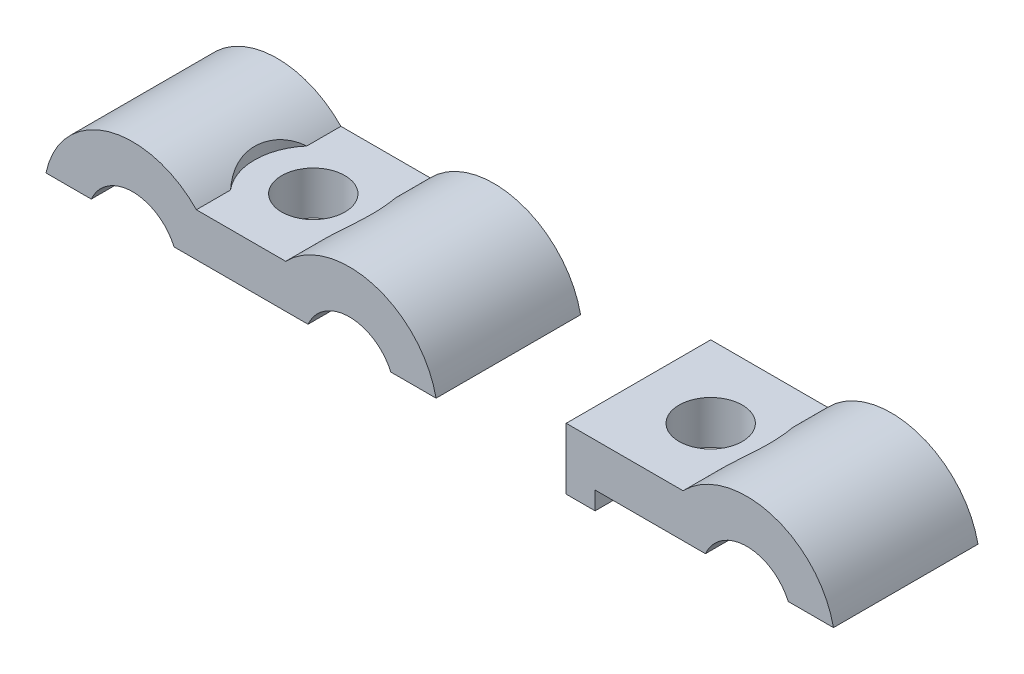
ISO-10303-21;
HEADER;
FILE_DESCRIPTION(('STEP AP214'),'2;1');
FILE_NAME('part.step','',(''),(''),'','','');
FILE_SCHEMA(('AUTOMOTIVE_DESIGN { 1 0 10303 214 1 1 1 1 }'));
ENDSEC;
DATA;
#1=APPLICATION_CONTEXT('core data for automotive mechanical design processes');
#2=APPLICATION_PROTOCOL_DEFINITION('international standard','automotive_design',2000,#1);
#3=PRODUCT_CONTEXT('',#1,'mechanical');
#4=PRODUCT('Part','Part','',(#3));
#5=PRODUCT_RELATED_PRODUCT_CATEGORY('part','',(#4));
#6=PRODUCT_DEFINITION_FORMATION('','',#4);
#7=PRODUCT_DEFINITION_CONTEXT('part definition',#1,'design');
#8=PRODUCT_DEFINITION('design','',#6,#7);
#9=PRODUCT_DEFINITION_SHAPE('','',#8);
#10=(LENGTH_UNIT() NAMED_UNIT(*) SI_UNIT(.MILLI.,.METRE.));
#11=(NAMED_UNIT(*) PLANE_ANGLE_UNIT() SI_UNIT($,.RADIAN.));
#12=(NAMED_UNIT(*) SI_UNIT($,.STERADIAN.) SOLID_ANGLE_UNIT());
#13=UNCERTAINTY_MEASURE_WITH_UNIT(LENGTH_MEASURE(1.E-05),#10,'distance_accuracy_value','');
#14=(GEOMETRIC_REPRESENTATION_CONTEXT(3) GLOBAL_UNCERTAINTY_ASSIGNED_CONTEXT((#13)) GLOBAL_UNIT_ASSIGNED_CONTEXT((#10,
#11,#12)) REPRESENTATION_CONTEXT('',''));
#15=CARTESIAN_POINT('',(0.,0.,0.));
#16=DIRECTION('',(0.,0.,1.));
#17=DIRECTION('',(1.,0.,0.));
#18=AXIS2_PLACEMENT_3D('',#15,#16,#17);
#19=CARTESIAN_POINT('',(40.,0.,8.));
#20=DIRECTION('',(0.,0.,-1.));
#21=DIRECTION('',(-1.,0.,0.));
#22=AXIS2_PLACEMENT_3D('',#19,#20,#21);
#23=CYLINDRICAL_SURFACE('',#22,4.9);
#24=CARTESIAN_POINT('',(36.4715442471245,3.4,6.11044285269837));
#25=CARTESIAN_POINT('',(36.5126094897117,3.44262606664709,6.06237296474449));
#26=CARTESIAN_POINT('',(36.5531708476087,3.48316500531181,6.01200938624019));
#27=CARTESIAN_POINT('',(36.6325990258749,3.56000670766943,5.90689234932348));
#28=CARTESIAN_POINT('',(36.6714656227098,3.59630891360113,5.85213831450949));
#29=CARTESIAN_POINT('',(36.7467730446983,3.66457379801481,5.73850086774534));
#30=CARTESIAN_POINT('',(36.7832159839324,3.69654028439891,5.6796211490794));
#31=CARTESIAN_POINT('',(36.8530655222025,3.75618317346056,5.55802163308008));
#32=CARTESIAN_POINT('',(36.8864724109546,3.78385998565997,5.49530220311047));
#33=CARTESIAN_POINT('',(36.9497210577356,3.83503029139799,5.36631374041905));
#34=CARTESIAN_POINT('',(36.9795571721354,3.85851719076012,5.30003932228713));
#35=CARTESIAN_POINT('',(37.0351089544764,3.90136543889939,5.16446699483715));
#36=CARTESIAN_POINT('',(37.0608230414361,3.92072520567156,5.09516793833865));
#37=CARTESIAN_POINT('',(37.1076783683864,3.95541751702336,4.95412227211976));
#38=CARTESIAN_POINT('',(37.1288233185441,3.97075333126209,4.88237770339834));
#39=CARTESIAN_POINT('',(37.1662458741903,3.9975441330316,4.73691345899355));
#40=CARTESIAN_POINT('',(37.1825216557406,4.00899766651487,4.66319305442191));
#41=CARTESIAN_POINT('',(37.2231850010033,4.0373808114907,4.44233892201103));
#42=CARTESIAN_POINT('',(37.2402314984068,4.04892008521854,4.29304863676129));
#43=CARTESIAN_POINT('',(37.2534647149747,4.05790534981671,3.99314976333009));
#44=CARTESIAN_POINT('',(37.2496434189639,4.05534592547131,3.8425406907895));
#45=CARTESIAN_POINT('',(37.2212688634578,4.03595737142103,3.54321595238569));
#46=CARTESIAN_POINT('',(37.1965828989471,4.01903689862099,3.39451860597906));
#47=CARTESIAN_POINT('',(37.1276969981287,3.97009329973268,3.10432058037719));
#48=CARTESIAN_POINT('',(37.0835004386544,3.93807278704717,2.96281866054393));
#49=CARTESIAN_POINT('',(36.9785180990321,3.85810424623574,2.69156170372002));
#50=CARTESIAN_POINT('',(36.9177929572136,3.81021430123257,2.56176599339154));
#51=CARTESIAN_POINT('',(36.7837083328936,3.69770912332429,2.31687482952486));
#52=CARTESIAN_POINT('',(36.710362188543,3.63311151155202,2.20176407800157));
#53=CARTESIAN_POINT('',(36.6070653237872,3.53543616834515,2.05893307027632));
#54=CARTESIAN_POINT('',(36.5803749522193,3.5096454804251,2.02361904360092));
#55=CARTESIAN_POINT('',(36.5263815938003,3.45621374118089,1.9550580869612));
#56=CARTESIAN_POINT('',(36.4990798495167,3.42857625017818,1.92180740512314));
#57=CARTESIAN_POINT('',(36.4715442471245,3.4,1.88955714730163));
#58=B_SPLINE_CURVE_WITH_KNOTS('',3,(#24,#25,#26,#27,#28,#29,#30,#31,#32,#33,#34,#35,#36,#37,#38,
#39,#40,#41,#42,#43,#44,#45,#46,#47,#48,#49,#50,#51,#52,#53,#54,#55,#56,#57),.UNSPECIFIED.,.F.,
.F.,(4,2,2,2,2,2,2,2,2,2,2,2,2,2,2,2,4),(0.,0.228698429314769,0.457426932644239,
0.685953233105201,0.914457703413783,1.14331868592199,1.37226723789039,1.60102917775049,
1.8298767023889,2.27968502233134,2.72966612268757,3.18253095224295,3.63531743206605,
4.08646465931051,4.53713800012588,4.69077450330599,4.8441229207092),.UNSPECIFIED.);
#59=CARTESIAN_POINT('',(36.4715442471245,3.4,6.11044285269837));
#60=VERTEX_POINT('',#59);
#61=CARTESIAN_POINT('',(36.4715442471245,3.4,1.88955714730163));
#62=VERTEX_POINT('',#61);
#63=EDGE_CURVE('E211',#60,#62,#58,.T.);
#64=ORIENTED_EDGE('',*,*,#63,.F.);
#65=DIRECTION('',(0.,0.,-1.));
#66=VECTOR('',#65,1.);
#67=CARTESIAN_POINT('',(36.4715442471245,3.4,8.));
#68=LINE('',#67,#66);
#69=CARTESIAN_POINT('',(36.4715442471245,3.4,8.));
#70=VERTEX_POINT('',#69);
#71=EDGE_CURVE('E184',#70,#60,#68,.T.);
#72=ORIENTED_EDGE('',*,*,#71,.F.);
#73=CARTESIAN_POINT('',(40.,0.,8.));
#74=DIRECTION('',(0.,0.,1.));
#75=DIRECTION('',(1.,0.,0.));
#76=AXIS2_PLACEMENT_3D('',#73,#74,#75);
#77=CIRCLE('',#76,4.9);
#78=CARTESIAN_POINT('',(44.7968739820846,1.,8.));
#79=VERTEX_POINT('',#78);
#80=EDGE_CURVE('E153',#79,#70,#77,.T.);
#81=ORIENTED_EDGE('',*,*,#80,.F.);
#82=DIRECTION('',(0.,0.,-1.));
#83=VECTOR('',#82,1.);
#84=CARTESIAN_POINT('',(44.7968739820846,1.,8.));
#85=LINE('',#84,#83);
#86=CARTESIAN_POINT('',(44.7968739820846,1.,0.));
#87=VERTEX_POINT('',#86);
#88=EDGE_CURVE('E186',#79,#87,#85,.T.);
#89=ORIENTED_EDGE('',*,*,#88,.T.);
#90=CARTESIAN_POINT('',(40.,0.,0.));
#91=DIRECTION('',(0.,0.,1.));
#92=DIRECTION('',(1.,0.,0.));
#93=AXIS2_PLACEMENT_3D('',#90,#91,#92);
#94=CIRCLE('',#93,4.9);
#95=CARTESIAN_POINT('',(36.4715442471245,3.4,0.));
#96=VERTEX_POINT('',#95);
#97=EDGE_CURVE('E173',#87,#96,#94,.T.);
#98=ORIENTED_EDGE('',*,*,#97,.T.);
#99=EDGE_CURVE('E143',#62,#96,#68,.T.);
#100=ORIENTED_EDGE('',*,*,#99,.F.);
#101=EDGE_LOOP('',(#64,#72,#81,#89,#98,#100));
#102=FACE_BOUND('',#101,.T.);
#103=ADVANCED_FACE('F57',(#102),#23,.T.);
#104=CARTESIAN_POINT('',(31.6,0.,8.));
#105=DIRECTION('',(1.,0.,0.));
#106=DIRECTION('',(0.,0.,-1.));
#107=AXIS2_PLACEMENT_3D('',#104,#105,#106);
#108=PLANE('',#107);
#109=DIRECTION('',(0.,-1.,0.));
#110=VECTOR('',#109,1.);
#111=CARTESIAN_POINT('',(31.6,0.,0.));
#112=LINE('',#111,#110);
#113=CARTESIAN_POINT('',(31.6,1.,0.));
#114=VERTEX_POINT('',#113);
#115=CARTESIAN_POINT('',(31.6,0.,0.));
#116=VERTEX_POINT('',#115);
#117=EDGE_CURVE('E161',#114,#116,#112,.T.);
#118=ORIENTED_EDGE('',*,*,#117,.F.);
#119=DIRECTION('',(0.,0.,-1.));
#120=VECTOR('',#119,1.);
#121=CARTESIAN_POINT('',(31.6,1.,8.));
#122=LINE('',#121,#120);
#123=CARTESIAN_POINT('',(31.6,1.,8.));
#124=VERTEX_POINT('',#123);
#125=EDGE_CURVE('E12',#124,#114,#122,.T.);
#126=ORIENTED_EDGE('',*,*,#125,.F.);
#127=DIRECTION('',(0.,-1.,0.));
#128=VECTOR('',#127,1.);
#129=CARTESIAN_POINT('',(31.6,0.,8.));
#130=LINE('',#129,#128);
#131=CARTESIAN_POINT('',(31.6,0.,8.));
#132=VERTEX_POINT('',#131);
#133=EDGE_CURVE('E181',#124,#132,#130,.T.);
#134=ORIENTED_EDGE('',*,*,#133,.T.);
#135=DIRECTION('',(0.,0.,-1.));
#136=VECTOR('',#135,1.);
#137=CARTESIAN_POINT('',(31.6,0.,8.));
#138=LINE('',#137,#136);
#139=EDGE_CURVE('E112',#132,#116,#138,.T.);
#140=ORIENTED_EDGE('',*,*,#139,.T.);
#141=EDGE_LOOP('',(#118,#126,#134,#140));
#142=FACE_BOUND('',#141,.T.);
#143=ADVANCED_FACE('F59',(#142),#108,.T.);
#144=CARTESIAN_POINT('',(0.,1.,8.));
#145=DIRECTION('',(0.,1.,0.));
#146=DIRECTION('',(0.,0.,1.));
#147=AXIS2_PLACEMENT_3D('',#144,#145,#146);
#148=PLANE('',#147);
#149=CARTESIAN_POINT('',(34.,1.,4.));
#150=DIRECTION('',(0.,1.,0.));
#151=DIRECTION('',(0.,0.,1.));
#152=AXIS2_PLACEMENT_3D('',#149,#150,#151);
#153=CIRCLE('',#152,1.75);
#154=CARTESIAN_POINT('',(34.,1.,5.75));
#155=VERTEX_POINT('',#154);
#156=EDGE_CURVE('E165',#155,#155,#153,.T.);
#157=ORIENTED_EDGE('',*,*,#156,.T.);
#158=EDGE_LOOP('',(#157));
#159=FACE_BOUND('',#158,.T.);
#160=DIRECTION('',(1.,0.,0.));
#161=VECTOR('',#160,1.);
#162=CARTESIAN_POINT('',(0.,1.,0.));
#163=LINE('',#162,#161);
#164=CARTESIAN_POINT('',(37.7087121525221,1.,0.));
#165=VERTEX_POINT('',#164);
#166=EDGE_CURVE('E164',#114,#165,#163,.T.);
#167=ORIENTED_EDGE('',*,*,#166,.T.);
#168=DIRECTION('',(0.,0.,-1.));
#169=VECTOR('',#168,1.);
#170=CARTESIAN_POINT('',(37.7087121525221,1.,8.));
#171=LINE('',#170,#169);
#172=CARTESIAN_POINT('',(37.7087121525221,1.,8.));
#173=VERTEX_POINT('',#172);
#174=EDGE_CURVE('E65',#173,#165,#171,.T.);
#175=ORIENTED_EDGE('',*,*,#174,.F.);
#176=DIRECTION('',(1.,0.,0.));
#177=VECTOR('',#176,1.);
#178=CARTESIAN_POINT('',(0.,1.,8.));
#179=LINE('',#178,#177);
#180=EDGE_CURVE('E258',#124,#173,#179,.T.);
#181=ORIENTED_EDGE('',*,*,#180,.F.);
#182=ORIENTED_EDGE('',*,*,#125,.T.);
#183=EDGE_LOOP('',(#167,#175,#181,#182));
#184=FACE_BOUND('',#183,.T.);
#185=ADVANCED_FACE('F199',(#159,#184),#148,.F.);
#186=CARTESIAN_POINT('',(40.,0.,8.));
#187=DIRECTION('',(0.,0.,-1.));
#188=DIRECTION('',(-1.,0.,0.));
#189=AXIS2_PLACEMENT_3D('',#186,#187,#188);
#190=CYLINDRICAL_SURFACE('',#189,2.5);
#191=CARTESIAN_POINT('',(40.,0.,0.));
#192=DIRECTION('',(0.,0.,1.));
#193=DIRECTION('',(1.,0.,0.));
#194=AXIS2_PLACEMENT_3D('',#191,#192,#193);
#195=CIRCLE('',#194,2.5);
#196=CARTESIAN_POINT('',(42.2912878474779,1.,0.));
#197=VERTEX_POINT('',#196);
#198=EDGE_CURVE('E168',#197,#165,#195,.T.);
#199=ORIENTED_EDGE('',*,*,#198,.F.);
#200=DIRECTION('',(0.,0.,-1.));
#201=VECTOR('',#200,1.);
#202=CARTESIAN_POINT('',(42.2912878474779,1.,8.));
#203=LINE('',#202,#201);
#204=CARTESIAN_POINT('',(42.2912878474779,1.,8.));
#205=VERTEX_POINT('',#204);
#206=EDGE_CURVE('E189',#205,#197,#203,.T.);
#207=ORIENTED_EDGE('',*,*,#206,.F.);
#208=CARTESIAN_POINT('',(40.,0.,8.));
#209=DIRECTION('',(0.,0.,1.));
#210=DIRECTION('',(1.,0.,0.));
#211=AXIS2_PLACEMENT_3D('',#208,#209,#210);
#212=CIRCLE('',#211,2.5);
#213=EDGE_CURVE('E196',#205,#173,#212,.T.);
#214=ORIENTED_EDGE('',*,*,#213,.T.);
#215=ORIENTED_EDGE('',*,*,#174,.T.);
#216=EDGE_LOOP('',(#199,#207,#214,#215));
#217=FACE_BOUND('',#216,.T.);
#218=ADVANCED_FACE('F194',(#217),#190,.F.);
#219=CARTESIAN_POINT('',(0.,1.,8.));
#220=DIRECTION('',(0.,1.,0.));
#221=DIRECTION('',(0.,0.,1.));
#222=AXIS2_PLACEMENT_3D('',#219,#220,#221);
#223=PLANE('',#222);
#224=DIRECTION('',(1.,0.,0.));
#225=VECTOR('',#224,1.);
#226=CARTESIAN_POINT('',(0.,1.,0.));
#227=LINE('',#226,#225);
#228=EDGE_CURVE('E171',#197,#87,#227,.T.);
#229=ORIENTED_EDGE('',*,*,#228,.T.);
#230=ORIENTED_EDGE('',*,*,#88,.F.);
#231=DIRECTION('',(1.,0.,0.));
#232=VECTOR('',#231,1.);
#233=CARTESIAN_POINT('',(0.,1.,8.));
#234=LINE('',#233,#232);
#235=EDGE_CURVE('E156',#205,#79,#234,.T.);
#236=ORIENTED_EDGE('',*,*,#235,.F.);
#237=ORIENTED_EDGE('',*,*,#206,.T.);
#238=EDGE_LOOP('',(#229,#230,#236,#237));
#239=FACE_BOUND('',#238,.T.);
#240=ADVANCED_FACE('F206',(#239),#223,.F.);
#241=CARTESIAN_POINT('',(0.,3.4,8.));
#242=DIRECTION('',(0.,1.,0.));
#243=DIRECTION('',(0.,0.,1.));
#244=AXIS2_PLACEMENT_3D('',#241,#242,#243);
#245=PLANE('',#244);
#246=ORIENTED_EDGE('',*,*,#71,.T.);
#247=CARTESIAN_POINT('',(34.,3.4,4.));
#248=DIRECTION('',(0.,1.,0.));
#249=DIRECTION('',(0.,0.,1.));
#250=AXIS2_PLACEMENT_3D('',#247,#248,#249);
#251=CIRCLE('',#250,3.25);
#252=EDGE_CURVE('E72',#60,#62,#251,.T.);
#253=ORIENTED_EDGE('',*,*,#252,.T.);
#254=ORIENTED_EDGE('',*,*,#99,.T.);
#255=DIRECTION('',(1.,0.,0.));
#256=VECTOR('',#255,1.);
#257=CARTESIAN_POINT('',(0.,3.4,0.));
#258=LINE('',#257,#256);
#259=CARTESIAN_POINT('',(30.,3.4,0.));
#260=VERTEX_POINT('',#259);
#261=EDGE_CURVE('E140',#260,#96,#258,.T.);
#262=ORIENTED_EDGE('',*,*,#261,.F.);
#263=DIRECTION('',(0.,0.,-1.));
#264=VECTOR('',#263,1.);
#265=CARTESIAN_POINT('',(30.,3.4,8.));
#266=LINE('',#265,#264);
#267=CARTESIAN_POINT('',(30.,3.4,8.));
#268=VERTEX_POINT('',#267);
#269=EDGE_CURVE('E133',#268,#260,#266,.T.);
#270=ORIENTED_EDGE('',*,*,#269,.F.);
#271=DIRECTION('',(1.,0.,0.));
#272=VECTOR('',#271,1.);
#273=CARTESIAN_POINT('',(0.,3.4,8.));
#274=LINE('',#273,#272);
#275=EDGE_CURVE('E138',#268,#70,#274,.T.);
#276=ORIENTED_EDGE('',*,*,#275,.T.);
#277=EDGE_LOOP('',(#246,#253,#254,#262,#270,#276));
#278=FACE_BOUND('',#277,.T.);
#279=CARTESIAN_POINT('',(34.,3.4,4.));
#280=DIRECTION('',(0.,1.,0.));
#281=DIRECTION('',(0.,0.,1.));
#282=AXIS2_PLACEMENT_3D('',#279,#280,#281);
#283=CIRCLE('',#282,1.75);
#284=CARTESIAN_POINT('',(34.,3.4,5.75));
#285=VERTEX_POINT('',#284);
#286=EDGE_CURVE('E215',#285,#285,#283,.T.);
#287=ORIENTED_EDGE('',*,*,#286,.F.);
#288=EDGE_LOOP('',(#287));
#289=FACE_BOUND('',#288,.T.);
#290=ADVANCED_FACE('F135',(#278,#289),#245,.T.);
#291=CARTESIAN_POINT('',(30.,0.,8.));
#292=DIRECTION('',(1.,0.,0.));
#293=DIRECTION('',(0.,0.,-1.));
#294=AXIS2_PLACEMENT_3D('',#291,#292,#293);
#295=PLANE('',#294);
#296=DIRECTION('',(0.,-1.,0.));
#297=VECTOR('',#296,1.);
#298=CARTESIAN_POINT('',(30.,0.,0.));
#299=LINE('',#298,#297);
#300=CARTESIAN_POINT('',(30.,0.,0.));
#301=VERTEX_POINT('',#300);
#302=EDGE_CURVE('E177',#260,#301,#299,.T.);
#303=ORIENTED_EDGE('',*,*,#302,.T.);
#304=DIRECTION('',(0.,0.,-1.));
#305=VECTOR('',#304,1.);
#306=CARTESIAN_POINT('',(30.,0.,8.));
#307=LINE('',#306,#305);
#308=CARTESIAN_POINT('',(30.,0.,8.));
#309=VERTEX_POINT('',#308);
#310=EDGE_CURVE('E144',#309,#301,#307,.T.);
#311=ORIENTED_EDGE('',*,*,#310,.F.);
#312=DIRECTION('',(0.,-1.,0.));
#313=VECTOR('',#312,1.);
#314=CARTESIAN_POINT('',(30.,0.,8.));
#315=LINE('',#314,#313);
#316=EDGE_CURVE('E147',#268,#309,#315,.T.);
#317=ORIENTED_EDGE('',*,*,#316,.F.);
#318=ORIENTED_EDGE('',*,*,#269,.T.);
#319=EDGE_LOOP('',(#303,#311,#317,#318));
#320=FACE_BOUND('',#319,.T.);
#321=ADVANCED_FACE('F148',(#320),#295,.F.);
#322=CARTESIAN_POINT('',(0.,1.13214314601504E-13,8.));
#323=DIRECTION('',(0.,1.,0.));
#324=DIRECTION('',(-1.,0.,0.));
#325=AXIS2_PLACEMENT_3D('',#322,#323,#324);
#326=PLANE('',#325);
#327=DIRECTION('',(1.,0.,0.));
#328=VECTOR('',#327,1.);
#329=CARTESIAN_POINT('',(0.,1.13214314601504E-13,0.));
#330=LINE('',#329,#328);
#331=EDGE_CURVE('E179',#301,#116,#330,.T.);
#332=ORIENTED_EDGE('',*,*,#331,.T.);
#333=ORIENTED_EDGE('',*,*,#139,.F.);
#334=DIRECTION('',(1.,0.,0.));
#335=VECTOR('',#334,1.);
#336=CARTESIAN_POINT('',(0.,1.13214314601504E-13,8.));
#337=LINE('',#336,#335);
#338=EDGE_CURVE('E81',#309,#132,#337,.T.);
#339=ORIENTED_EDGE('',*,*,#338,.F.);
#340=ORIENTED_EDGE('',*,*,#310,.T.);
#341=EDGE_LOOP('',(#332,#333,#339,#340));
#342=FACE_BOUND('',#341,.T.);
#343=ADVANCED_FACE('F237',(#342),#326,.F.);
#344=CARTESIAN_POINT('',(0.,0.,8.));
#345=DIRECTION('',(0.,0.,1.));
#346=DIRECTION('',(1.,0.,0.));
#347=AXIS2_PLACEMENT_3D('',#344,#345,#346);
#348=PLANE('',#347);
#349=ORIENTED_EDGE('',*,*,#133,.F.);
#350=ORIENTED_EDGE('',*,*,#180,.T.);
#351=ORIENTED_EDGE('',*,*,#213,.F.);
#352=ORIENTED_EDGE('',*,*,#235,.T.);
#353=ORIENTED_EDGE('',*,*,#80,.T.);
#354=ORIENTED_EDGE('',*,*,#275,.F.);
#355=ORIENTED_EDGE('',*,*,#316,.T.);
#356=ORIENTED_EDGE('',*,*,#338,.T.);
#357=EDGE_LOOP('',(#349,#350,#351,#352,#353,#354,#355,#356));
#358=FACE_BOUND('',#357,.T.);
#359=ADVANCED_FACE('F151',(#358),#348,.T.);
#360=CARTESIAN_POINT('',(0.,0.,0.));
#361=DIRECTION('',(0.,0.,1.));
#362=DIRECTION('',(1.,0.,0.));
#363=AXIS2_PLACEMENT_3D('',#360,#361,#362);
#364=PLANE('',#363);
#365=ORIENTED_EDGE('',*,*,#117,.T.);
#366=ORIENTED_EDGE('',*,*,#331,.F.);
#367=ORIENTED_EDGE('',*,*,#302,.F.);
#368=ORIENTED_EDGE('',*,*,#261,.T.);
#369=ORIENTED_EDGE('',*,*,#97,.F.);
#370=ORIENTED_EDGE('',*,*,#228,.F.);
#371=ORIENTED_EDGE('',*,*,#198,.T.);
#372=ORIENTED_EDGE('',*,*,#166,.F.);
#373=EDGE_LOOP('',(#365,#366,#367,#368,#369,#370,#371,#372));
#374=FACE_BOUND('',#373,.T.);
#375=ADVANCED_FACE('F202',(#374),#364,.F.);
#376=CARTESIAN_POINT('',(34.,-4.6,4.));
#377=DIRECTION('',(0.,1.,0.));
#378=DIRECTION('',(0.,0.,1.));
#379=AXIS2_PLACEMENT_3D('',#376,#377,#378);
#380=CYLINDRICAL_SURFACE('',#379,1.75);
#381=ORIENTED_EDGE('',*,*,#286,.T.);
#382=EDGE_LOOP('',(#381));
#383=FACE_BOUND('',#382,.T.);
#384=ORIENTED_EDGE('',*,*,#156,.F.);
#385=EDGE_LOOP('',(#384));
#386=FACE_BOUND('',#385,.T.);
#387=ADVANCED_FACE('F231',(#383,#386),#380,.F.);
#388=CARTESIAN_POINT('',(34.,11.4,4.));
#389=DIRECTION('',(0.,-1.,0.));
#390=DIRECTION('',(0.,0.,-1.));
#391=AXIS2_PLACEMENT_3D('',#388,#389,#390);
#392=CYLINDRICAL_SURFACE('',#391,3.25);
#393=ORIENTED_EDGE('',*,*,#63,.T.);
#394=ORIENTED_EDGE('',*,*,#252,.F.);
#395=EDGE_LOOP('',(#393,#394));
#396=FACE_BOUND('',#395,.T.);
#397=ADVANCED_FACE('F213',(#396),#392,.F.);
#398=CLOSED_SHELL('',(#103,#143,#185,#218,#240,#290,#321,#343,#359,#375,#387,#397));
#399=MANIFOLD_SOLID_BREP('B2',#398);
#400=CARTESIAN_POINT('',(18.,0.,8.));
#401=DIRECTION('',(0.,0.,-1.));
#402=DIRECTION('',(-1.,0.,0.));
#403=AXIS2_PLACEMENT_3D('',#400,#401,#402);
#404=CYLINDRICAL_SURFACE('',#403,4.9);
#405=CARTESIAN_POINT('',(14.4715442471245,3.4,6.11044285269837));
#406=CARTESIAN_POINT('',(14.5126094897117,3.44262606664708,6.06237296474449));
#407=CARTESIAN_POINT('',(14.5531708476087,3.48316500531181,6.01200938624019));
#408=CARTESIAN_POINT('',(14.6325990258749,3.56000670766943,5.90689234932348));
#409=CARTESIAN_POINT('',(14.6714656227098,3.59630891360113,5.85213831450949));
#410=CARTESIAN_POINT('',(14.7467730446983,3.6645737980148,5.73850086774534));
#411=CARTESIAN_POINT('',(14.7832159839324,3.69654028439891,5.67962114907941));
#412=CARTESIAN_POINT('',(14.8530655222025,3.75618317346055,5.55802163308008));
#413=CARTESIAN_POINT('',(14.8864724109546,3.78385998565997,5.49530220311047));
#414=CARTESIAN_POINT('',(14.9497210577356,3.83503029139798,5.36631374041905));
#415=CARTESIAN_POINT('',(14.9795571721354,3.85851719076012,5.30003932228713));
#416=CARTESIAN_POINT('',(15.0351089544764,3.90136543889939,5.16446699483715));
#417=CARTESIAN_POINT('',(15.0608230414361,3.92072520567156,5.09516793833865));
#418=CARTESIAN_POINT('',(15.1076783683864,3.95541751702335,4.95412227211976));
#419=CARTESIAN_POINT('',(15.1288233185441,3.97075333126208,4.88237770339834));
#420=CARTESIAN_POINT('',(15.1662458741903,3.9975441330316,4.73691345899355));
#421=CARTESIAN_POINT('',(15.1825216557406,4.00899766651486,4.66319305442191));
#422=CARTESIAN_POINT('',(15.2231850010033,4.03738081149069,4.44233892201104));
#423=CARTESIAN_POINT('',(15.2402314984068,4.04892008521853,4.2930486367613));
#424=CARTESIAN_POINT('',(15.2534647149747,4.0579053498167,3.99314976333009));
#425=CARTESIAN_POINT('',(15.2496434189639,4.05534592547131,3.84254069078951));
#426=CARTESIAN_POINT('',(15.2212688634578,4.03595737142102,3.5432159523857));
#427=CARTESIAN_POINT('',(15.1965828989471,4.01903689862099,3.39451860597907));
#428=CARTESIAN_POINT('',(15.1276969981287,3.97009329973267,3.1043205803772));
#429=CARTESIAN_POINT('',(15.0835004386544,3.93807278704717,2.96281866054394));
#430=CARTESIAN_POINT('',(14.9785180990321,3.85810424623574,2.69156170372002));
#431=CARTESIAN_POINT('',(14.9177929572136,3.81021430123257,2.56176599339154));
#432=CARTESIAN_POINT('',(14.7837083328936,3.69770912332428,2.31687482952487));
#433=CARTESIAN_POINT('',(14.710362188543,3.63311151155202,2.20176407800158));
#434=CARTESIAN_POINT('',(14.6070653237872,3.53543616834515,2.05893307027633));
#435=CARTESIAN_POINT('',(14.5803749522193,3.5096454804251,2.02361904360093));
#436=CARTESIAN_POINT('',(14.5263815938003,3.45621374118089,1.9550580869612));
#437=CARTESIAN_POINT('',(14.4990798495167,3.42857625017817,1.92180740512314));
#438=CARTESIAN_POINT('',(14.4715442471245,3.4,1.88955714730163));
#439=B_SPLINE_CURVE_WITH_KNOTS('',3,(#405,#406,#407,#408,#409,#410,#411,#412,#413,#414,#415,
#416,#417,#418,#419,#420,#421,#422,#423,#424,#425,#426,#427,#428,#429,#430,#431,#432,#433,#434,
#435,#436,#437,#438),.UNSPECIFIED.,.F.,.F.,(4,2,2,2,2,2,2,2,2,2,2,2,2,2,2,2,4),(0.,
0.228698429314768,0.457426932644234,0.68595323310519,0.914457703413778,1.14331868592199,
1.37226723789038,1.60102917775048,1.82987670238889,2.27968502233133,2.72966612268756,
3.18253095224294,3.63531743206604,4.08646465931051,4.53713800012587,4.69077450330598,
4.84412292070919),.UNSPECIFIED.);
#440=CARTESIAN_POINT('',(14.4715442471245,3.4,6.11044285269837));
#441=VERTEX_POINT('',#440);
#442=CARTESIAN_POINT('',(14.4715442471245,3.4,1.88955714730163));
#443=VERTEX_POINT('',#442);
#444=EDGE_CURVE('E449',#441,#443,#439,.T.);
#445=ORIENTED_EDGE('',*,*,#444,.F.);
#446=DIRECTION('',(0.,0.,-1.));
#447=VECTOR('',#446,1.);
#448=CARTESIAN_POINT('',(14.4715442471245,3.4,8.));
#449=LINE('',#448,#447);
#450=CARTESIAN_POINT('',(14.4715442471245,3.4,8.));
#451=VERTEX_POINT('',#450);
#452=EDGE_CURVE('E456',#451,#441,#449,.T.);
#453=ORIENTED_EDGE('',*,*,#452,.F.);
#454=CARTESIAN_POINT('',(18.,0.,8.));
#455=DIRECTION('',(0.,0.,1.));
#456=DIRECTION('',(1.,0.,0.));
#457=AXIS2_PLACEMENT_3D('',#454,#455,#456);
#458=CIRCLE('',#457,4.9);
#459=CARTESIAN_POINT('',(22.7968739820846,1.,8.));
#460=VERTEX_POINT('',#459);
#461=EDGE_CURVE('E555',#460,#451,#458,.T.);
#462=ORIENTED_EDGE('',*,*,#461,.F.);
#463=DIRECTION('',(0.,0.,-1.));
#464=VECTOR('',#463,1.);
#465=CARTESIAN_POINT('',(22.7968739820846,1.,8.));
#466=LINE('',#465,#464);
#467=CARTESIAN_POINT('',(22.7968739820846,1.,0.));
#468=VERTEX_POINT('',#467);
#469=EDGE_CURVE('E468',#460,#468,#466,.T.);
#470=ORIENTED_EDGE('',*,*,#469,.T.);
#471=CARTESIAN_POINT('',(18.,0.,0.));
#472=DIRECTION('',(0.,0.,1.));
#473=DIRECTION('',(1.,0.,0.));
#474=AXIS2_PLACEMENT_3D('',#471,#472,#473);
#475=CIRCLE('',#474,4.9);
#476=CARTESIAN_POINT('',(14.4715442471245,3.4,0.));
#477=VERTEX_POINT('',#476);
#478=EDGE_CURVE('E510',#468,#477,#475,.T.);
#479=ORIENTED_EDGE('',*,*,#478,.T.);
#480=EDGE_CURVE('E459',#443,#477,#449,.T.);
#481=ORIENTED_EDGE('',*,*,#480,.F.);
#482=EDGE_LOOP('',(#445,#453,#462,#470,#479,#481));
#483=FACE_BOUND('',#482,.T.);
#484=ADVANCED_FACE('F367',(#483),#404,.T.);
#485=CARTESIAN_POINT('',(6.,0.,8.));
#486=DIRECTION('',(0.,0.,-1.));
#487=DIRECTION('',(-1.,0.,0.));
#488=AXIS2_PLACEMENT_3D('',#485,#486,#487);
#489=CYLINDRICAL_SURFACE('',#488,4.9);
#490=CARTESIAN_POINT('',(9.52845575287547,3.4,1.88955714730163));
#491=CARTESIAN_POINT('',(9.4873905102883,3.44262606664708,1.93762703525552));
#492=CARTESIAN_POINT('',(9.44682915239132,3.48316500531181,1.98799061375982));
#493=CARTESIAN_POINT('',(9.36740097412511,3.56000670766943,2.09310765067652));
#494=CARTESIAN_POINT('',(9.32853437729023,3.59630891360113,2.14786168549051));
#495=CARTESIAN_POINT('',(9.25322695530168,3.6645737980148,2.26149913225466));
#496=CARTESIAN_POINT('',(9.21678401606757,3.69654028439891,2.3203788509206));
#497=CARTESIAN_POINT('',(9.14693447779755,3.75618317346055,2.44197836691992));
#498=CARTESIAN_POINT('',(9.11352758904542,3.78385998565997,2.50469779688953));
#499=CARTESIAN_POINT('',(9.05027894226437,3.83503029139798,2.63368625958095));
#500=CARTESIAN_POINT('',(9.02044282786462,3.85851719076012,2.69996067771287));
#501=CARTESIAN_POINT('',(8.96489104552363,3.90136543889939,2.83553300516285));
#502=CARTESIAN_POINT('',(8.93917695856391,3.92072520567156,2.90483206166135));
#503=CARTESIAN_POINT('',(8.89232163161363,3.95541751702335,3.04587772788024));
#504=CARTESIAN_POINT('',(8.87117668145595,3.97075333126208,3.11762229660166));
#505=CARTESIAN_POINT('',(8.83375412580969,3.9975441330316,3.26308654100645));
#506=CARTESIAN_POINT('',(8.81747834425939,4.00899766651486,3.33680694557809));
#507=CARTESIAN_POINT('',(8.7768149989967,4.03738081149069,3.55766107798896));
#508=CARTESIAN_POINT('',(8.75976850159319,4.04892008521853,3.7069513632387));
#509=CARTESIAN_POINT('',(8.74653528502531,4.0579053498167,4.00685023666991));
#510=CARTESIAN_POINT('',(8.75035658103608,4.05534592547131,4.15745930921049));
#511=CARTESIAN_POINT('',(8.77873113654219,4.03595737142102,4.4567840476143));
#512=CARTESIAN_POINT('',(8.8034171010529,4.01903689862099,4.60548139402093));
#513=CARTESIAN_POINT('',(8.87230300187131,3.97009329973267,4.8956794196228));
#514=CARTESIAN_POINT('',(8.91649956134559,3.93807278704717,5.03718133945606));
#515=CARTESIAN_POINT('',(9.02148190096793,3.85810424623574,5.30843829627998));
#516=CARTESIAN_POINT('',(9.08220704278639,3.81021430123257,5.43823400660846));
#517=CARTESIAN_POINT('',(9.21629166710643,3.69770912332428,5.68312517047513));
#518=CARTESIAN_POINT('',(9.28963781145699,3.63311151155201,5.79823592199842));
#519=CARTESIAN_POINT('',(9.3929346762128,3.53543616834515,5.94106692972367));
#520=CARTESIAN_POINT('',(9.41962504778072,3.5096454804251,5.97638095639907));
#521=CARTESIAN_POINT('',(9.47361840619966,3.45621374118089,6.0449419130388));
#522=CARTESIAN_POINT('',(9.50092015048328,3.42857625017817,6.07819259487686));
#523=CARTESIAN_POINT('',(9.52845575287547,3.4,6.11044285269837));
#524=B_SPLINE_CURVE_WITH_KNOTS('',3,(#490,#491,#492,#493,#494,#495,#496,#497,#498,#499,#500,
#501,#502,#503,#504,#505,#506,#507,#508,#509,#510,#511,#512,#513,#514,#515,#516,#517,#518,#519,
#520,#521,#522,#523),.UNSPECIFIED.,.F.,.F.,(4,2,2,2,2,2,2,2,2,2,2,2,2,2,2,2,4),(0.,
0.228698429314769,0.457426932644234,0.685953233105189,0.914457703413777,1.14331868592198,
1.37226723789038,1.60102917775048,1.82987670238889,2.27968502233133,2.72966612268756,
3.18253095224294,3.63531743206604,4.0864646593105,4.53713800012587,4.69077450330598,
4.84412292070919),.UNSPECIFIED.);
#525=CARTESIAN_POINT('',(9.52845575287547,3.4,1.88955714730163));
#526=VERTEX_POINT('',#525);
#527=CARTESIAN_POINT('',(9.52845575287547,3.4,6.11044285269837));
#528=VERTEX_POINT('',#527);
#529=EDGE_CURVE('E55',#526,#528,#524,.T.);
#530=ORIENTED_EDGE('',*,*,#529,.F.);
#531=DIRECTION('',(0.,0.,-1.));
#532=VECTOR('',#531,1.);
#533=CARTESIAN_POINT('',(9.52845575287547,3.4,8.));
#534=LINE('',#533,#532);
#535=CARTESIAN_POINT('',(9.52845575287547,3.4,0.));
#536=VERTEX_POINT('',#535);
#537=EDGE_CURVE('E535',#526,#536,#534,.T.);
#538=ORIENTED_EDGE('',*,*,#537,.T.);
#539=CARTESIAN_POINT('',(6.,0.,0.));
#540=DIRECTION('',(0.,0.,1.));
#541=DIRECTION('',(1.,0.,0.));
#542=AXIS2_PLACEMENT_3D('',#539,#540,#541);
#543=CIRCLE('',#542,4.9);
#544=CARTESIAN_POINT('',(1.20312601791542,1.,0.));
#545=VERTEX_POINT('',#544);
#546=EDGE_CURVE('E520',#536,#545,#543,.T.);
#547=ORIENTED_EDGE('',*,*,#546,.T.);
#548=DIRECTION('',(0.,0.,-1.));
#549=VECTOR('',#548,1.);
#550=CARTESIAN_POINT('',(1.20312601791542,1.,8.));
#551=LINE('',#550,#549);
#552=CARTESIAN_POINT('',(1.20312601791542,1.,8.));
#553=VERTEX_POINT('',#552);
#554=EDGE_CURVE('E532',#553,#545,#551,.T.);
#555=ORIENTED_EDGE('',*,*,#554,.F.);
#556=CARTESIAN_POINT('',(6.,0.,8.));
#557=DIRECTION('',(0.,0.,1.));
#558=DIRECTION('',(1.,0.,0.));
#559=AXIS2_PLACEMENT_3D('',#556,#557,#558);
#560=CIRCLE('',#559,4.9);
#561=CARTESIAN_POINT('',(9.52845575287547,3.4,8.));
#562=VERTEX_POINT('',#561);
#563=EDGE_CURVE('E549',#562,#553,#560,.T.);
#564=ORIENTED_EDGE('',*,*,#563,.F.);
#565=EDGE_CURVE('E475',#562,#528,#534,.T.);
#566=ORIENTED_EDGE('',*,*,#565,.T.);
#567=EDGE_LOOP('',(#530,#538,#547,#555,#564,#566));
#568=FACE_BOUND('',#567,.T.);
#569=ADVANCED_FACE('F548',(#568),#489,.T.);
#570=CARTESIAN_POINT('',(0.,1.,8.));
#571=DIRECTION('',(0.,1.,0.));
#572=DIRECTION('',(0.,0.,1.));
#573=AXIS2_PLACEMENT_3D('',#570,#571,#572);
#574=PLANE('',#573);
#575=CARTESIAN_POINT('',(12.,1.,4.));
#576=DIRECTION('',(0.,1.,0.));
#577=DIRECTION('',(0.,0.,1.));
#578=AXIS2_PLACEMENT_3D('',#575,#576,#577);
#579=CIRCLE('',#578,1.75);
#580=CARTESIAN_POINT('',(12.,1.,5.75));
#581=VERTEX_POINT('',#580);
#582=EDGE_CURVE('E500',#581,#581,#579,.T.);
#583=ORIENTED_EDGE('',*,*,#582,.T.);
#584=EDGE_LOOP('',(#583));
#585=FACE_BOUND('',#584,.T.);
#586=DIRECTION('',(1.,0.,0.));
#587=VECTOR('',#586,1.);
#588=CARTESIAN_POINT('',(0.,1.,0.));
#589=LINE('',#588,#587);
#590=CARTESIAN_POINT('',(8.29128784747792,1.,0.));
#591=VERTEX_POINT('',#590);
#592=CARTESIAN_POINT('',(15.7087121525221,1.,0.));
#593=VERTEX_POINT('',#592);
#594=EDGE_CURVE('E493',#591,#593,#589,.T.);
#595=ORIENTED_EDGE('',*,*,#594,.T.);
#596=DIRECTION('',(0.,0.,-1.));
#597=VECTOR('',#596,1.);
#598=CARTESIAN_POINT('',(15.7087121525221,1.,8.));
#599=LINE('',#598,#597);
#600=CARTESIAN_POINT('',(15.7087121525221,1.,8.));
#601=VERTEX_POINT('',#600);
#602=EDGE_CURVE('E382',#601,#593,#599,.T.);
#603=ORIENTED_EDGE('',*,*,#602,.F.);
#604=DIRECTION('',(1.,0.,0.));
#605=VECTOR('',#604,1.);
#606=CARTESIAN_POINT('',(0.,1.,8.));
#607=LINE('',#606,#605);
#608=CARTESIAN_POINT('',(8.29128784747792,1.,8.));
#609=VERTEX_POINT('',#608);
#610=EDGE_CURVE('E526',#609,#601,#607,.T.);
#611=ORIENTED_EDGE('',*,*,#610,.F.);
#612=DIRECTION('',(0.,0.,-1.));
#613=VECTOR('',#612,1.);
#614=CARTESIAN_POINT('',(8.29128784747792,1.,8.));
#615=LINE('',#614,#613);
#616=EDGE_CURVE('E495',#609,#591,#615,.T.);
#617=ORIENTED_EDGE('',*,*,#616,.T.);
#618=EDGE_LOOP('',(#595,#603,#611,#617));
#619=FACE_BOUND('',#618,.T.);
#620=ADVANCED_FACE('F494',(#585,#619),#574,.F.);
#621=CARTESIAN_POINT('',(18.,0.,8.));
#622=DIRECTION('',(0.,0.,-1.));
#623=DIRECTION('',(-1.,0.,0.));
#624=AXIS2_PLACEMENT_3D('',#621,#622,#623);
#625=CYLINDRICAL_SURFACE('',#624,2.5);
#626=CARTESIAN_POINT('',(18.,0.,0.));
#627=DIRECTION('',(0.,0.,1.));
#628=DIRECTION('',(1.,0.,0.));
#629=AXIS2_PLACEMENT_3D('',#626,#627,#628);
#630=CIRCLE('',#629,2.5);
#631=CARTESIAN_POINT('',(20.2912878474779,1.,0.));
#632=VERTEX_POINT('',#631);
#633=EDGE_CURVE('E487',#632,#593,#630,.T.);
#634=ORIENTED_EDGE('',*,*,#633,.F.);
#635=DIRECTION('',(0.,0.,-1.));
#636=VECTOR('',#635,1.);
#637=CARTESIAN_POINT('',(20.2912878474779,1.,8.));
#638=LINE('',#637,#636);
#639=CARTESIAN_POINT('',(20.2912878474779,1.,8.));
#640=VERTEX_POINT('',#639);
#641=EDGE_CURVE('E473',#640,#632,#638,.T.);
#642=ORIENTED_EDGE('',*,*,#641,.F.);
#643=CARTESIAN_POINT('',(18.,0.,8.));
#644=DIRECTION('',(0.,0.,1.));
#645=DIRECTION('',(1.,0.,0.));
#646=AXIS2_PLACEMENT_3D('',#643,#644,#645);
#647=CIRCLE('',#646,2.5);
#648=EDGE_CURVE('E489',#640,#601,#647,.T.);
#649=ORIENTED_EDGE('',*,*,#648,.T.);
#650=ORIENTED_EDGE('',*,*,#602,.T.);
#651=EDGE_LOOP('',(#634,#642,#649,#650));
#652=FACE_BOUND('',#651,.T.);
#653=ADVANCED_FACE('F369',(#652),#625,.F.);
#654=CARTESIAN_POINT('',(0.,1.,8.));
#655=DIRECTION('',(0.,1.,0.));
#656=DIRECTION('',(0.,0.,1.));
#657=AXIS2_PLACEMENT_3D('',#654,#655,#656);
#658=PLANE('',#657);
#659=DIRECTION('',(1.,0.,0.));
#660=VECTOR('',#659,1.);
#661=CARTESIAN_POINT('',(0.,1.,0.));
#662=LINE('',#661,#660);
#663=EDGE_CURVE('E506',#632,#468,#662,.T.);
#664=ORIENTED_EDGE('',*,*,#663,.T.);
#665=ORIENTED_EDGE('',*,*,#469,.F.);
#666=DIRECTION('',(1.,0.,0.));
#667=VECTOR('',#666,1.);
#668=CARTESIAN_POINT('',(0.,1.,8.));
#669=LINE('',#668,#667);
#670=EDGE_CURVE('E559',#640,#460,#669,.T.);
#671=ORIENTED_EDGE('',*,*,#670,.F.);
#672=ORIENTED_EDGE('',*,*,#641,.T.);
#673=EDGE_LOOP('',(#664,#665,#671,#672));
#674=FACE_BOUND('',#673,.T.);
#675=ADVANCED_FACE('F577',(#674),#658,.F.);
#676=CARTESIAN_POINT('',(0.,3.4,8.));
#677=DIRECTION('',(0.,1.,0.));
#678=DIRECTION('',(0.,0.,1.));
#679=AXIS2_PLACEMENT_3D('',#676,#677,#678);
#680=PLANE('',#679);
#681=ORIENTED_EDGE('',*,*,#452,.T.);
#682=CARTESIAN_POINT('',(12.,3.4,4.));
#683=DIRECTION('',(0.,1.,0.));
#684=DIRECTION('',(0.,0.,1.));
#685=AXIS2_PLACEMENT_3D('',#682,#683,#684);
#686=CIRCLE('',#685,3.25);
#687=EDGE_CURVE('E389',#441,#443,#686,.T.);
#688=ORIENTED_EDGE('',*,*,#687,.T.);
#689=ORIENTED_EDGE('',*,*,#480,.T.);
#690=DIRECTION('',(1.,0.,0.));
#691=VECTOR('',#690,1.);
#692=CARTESIAN_POINT('',(0.,3.4,0.));
#693=LINE('',#692,#691);
#694=EDGE_CURVE('E516',#536,#477,#693,.T.);
#695=ORIENTED_EDGE('',*,*,#694,.F.);
#696=ORIENTED_EDGE('',*,*,#537,.F.);
#697=EDGE_CURVE('E396',#526,#528,#686,.T.);
#698=ORIENTED_EDGE('',*,*,#697,.T.);
#699=ORIENTED_EDGE('',*,*,#565,.F.);
#700=DIRECTION('',(1.,0.,0.));
#701=VECTOR('',#700,1.);
#702=CARTESIAN_POINT('',(0.,3.4,8.));
#703=LINE('',#702,#701);
#704=EDGE_CURVE('E466',#562,#451,#703,.T.);
#705=ORIENTED_EDGE('',*,*,#704,.T.);
#706=EDGE_LOOP('',(#681,#688,#689,#695,#696,#698,#699,#705));
#707=FACE_BOUND('',#706,.T.);
#708=CARTESIAN_POINT('',(12.,3.4,4.));
#709=DIRECTION('',(0.,1.,0.));
#710=DIRECTION('',(0.,0.,1.));
#711=AXIS2_PLACEMENT_3D('',#708,#709,#710);
#712=CIRCLE('',#711,1.75);
#713=CARTESIAN_POINT('',(12.,3.4,5.75));
#714=VERTEX_POINT('',#713);
#715=EDGE_CURVE('E461',#714,#714,#712,.T.);
#716=ORIENTED_EDGE('',*,*,#715,.F.);
#717=EDGE_LOOP('',(#716));
#718=FACE_BOUND('',#717,.T.);
#719=ADVANCED_FACE('F463',(#707,#718),#680,.T.);
#720=CARTESIAN_POINT('',(3.70871215252208,1.,0.));
#721=VERTEX_POINT('',#720);
#722=EDGE_CURVE('E502',#545,#721,#589,.T.);
#723=ORIENTED_EDGE('',*,*,#722,.T.);
#724=DIRECTION('',(0.,0.,-1.));
#725=VECTOR('',#724,1.);
#726=CARTESIAN_POINT('',(3.70871215252208,1.,8.));
#727=LINE('',#726,#725);
#728=CARTESIAN_POINT('',(3.70871215252208,1.,8.));
#729=VERTEX_POINT('',#728);
#730=EDGE_CURVE('E529',#729,#721,#727,.T.);
#731=ORIENTED_EDGE('',*,*,#730,.F.);
#732=EDGE_CURVE('E552',#553,#729,#607,.T.);
#733=ORIENTED_EDGE('',*,*,#732,.F.);
#734=ORIENTED_EDGE('',*,*,#554,.T.);
#735=EDGE_LOOP('',(#723,#731,#733,#734));
#736=FACE_BOUND('',#735,.T.);
#737=ADVANCED_FACE('F580',(#736),#574,.F.);
#738=CARTESIAN_POINT('',(6.,0.,8.));
#739=DIRECTION('',(0.,0.,-1.));
#740=DIRECTION('',(-1.,0.,0.));
#741=AXIS2_PLACEMENT_3D('',#738,#739,#740);
#742=CYLINDRICAL_SURFACE('',#741,2.5);
#743=CARTESIAN_POINT('',(6.,0.,0.));
#744=DIRECTION('',(0.,0.,1.));
#745=DIRECTION('',(1.,0.,0.));
#746=AXIS2_PLACEMENT_3D('',#743,#744,#745);
#747=CIRCLE('',#746,2.5);
#748=EDGE_CURVE('E523',#591,#721,#747,.T.);
#749=ORIENTED_EDGE('',*,*,#748,.F.);
#750=ORIENTED_EDGE('',*,*,#616,.F.);
#751=CARTESIAN_POINT('',(6.,0.,8.));
#752=DIRECTION('',(0.,0.,1.));
#753=DIRECTION('',(1.,0.,0.));
#754=AXIS2_PLACEMENT_3D('',#751,#752,#753);
#755=CIRCLE('',#754,2.5);
#756=EDGE_CURVE('E530',#609,#729,#755,.T.);
#757=ORIENTED_EDGE('',*,*,#756,.T.);
#758=ORIENTED_EDGE('',*,*,#730,.T.);
#759=EDGE_LOOP('',(#749,#750,#757,#758));
#760=FACE_BOUND('',#759,.T.);
#761=ADVANCED_FACE('F581',(#760),#742,.F.);
#762=CARTESIAN_POINT('',(0.,0.,8.));
#763=DIRECTION('',(0.,0.,1.));
#764=DIRECTION('',(1.,0.,0.));
#765=AXIS2_PLACEMENT_3D('',#762,#763,#764);
#766=PLANE('',#765);
#767=ORIENTED_EDGE('',*,*,#610,.T.);
#768=ORIENTED_EDGE('',*,*,#648,.F.);
#769=ORIENTED_EDGE('',*,*,#670,.T.);
#770=ORIENTED_EDGE('',*,*,#461,.T.);
#771=ORIENTED_EDGE('',*,*,#704,.F.);
#772=ORIENTED_EDGE('',*,*,#563,.T.);
#773=ORIENTED_EDGE('',*,*,#732,.T.);
#774=ORIENTED_EDGE('',*,*,#756,.F.);
#775=EDGE_LOOP('',(#767,#768,#769,#770,#771,#772,#773,#774));
#776=FACE_BOUND('',#775,.T.);
#777=ADVANCED_FACE('F554',(#776),#766,.T.);
#778=CARTESIAN_POINT('',(0.,0.,0.));
#779=DIRECTION('',(0.,0.,1.));
#780=DIRECTION('',(1.,0.,0.));
#781=AXIS2_PLACEMENT_3D('',#778,#779,#780);
#782=PLANE('',#781);
#783=ORIENTED_EDGE('',*,*,#594,.F.);
#784=ORIENTED_EDGE('',*,*,#748,.T.);
#785=ORIENTED_EDGE('',*,*,#722,.F.);
#786=ORIENTED_EDGE('',*,*,#546,.F.);
#787=ORIENTED_EDGE('',*,*,#694,.T.);
#788=ORIENTED_EDGE('',*,*,#478,.F.);
#789=ORIENTED_EDGE('',*,*,#663,.F.);
#790=ORIENTED_EDGE('',*,*,#633,.T.);
#791=EDGE_LOOP('',(#783,#784,#785,#786,#787,#788,#789,#790));
#792=FACE_BOUND('',#791,.T.);
#793=ADVANCED_FACE('F504',(#792),#782,.F.);
#794=CARTESIAN_POINT('',(12.,-4.6,4.));
#795=DIRECTION('',(0.,1.,0.));
#796=DIRECTION('',(0.,0.,1.));
#797=AXIS2_PLACEMENT_3D('',#794,#795,#796);
#798=CYLINDRICAL_SURFACE('',#797,1.75);
#799=ORIENTED_EDGE('',*,*,#715,.T.);
#800=EDGE_LOOP('',(#799));
#801=FACE_BOUND('',#800,.T.);
#802=ORIENTED_EDGE('',*,*,#582,.F.);
#803=EDGE_LOOP('',(#802));
#804=FACE_BOUND('',#803,.T.);
#805=ADVANCED_FACE('F608',(#801,#804),#798,.F.);
#806=CARTESIAN_POINT('',(12.,11.4,4.));
#807=DIRECTION('',(0.,-1.,0.));
#808=DIRECTION('',(0.,0.,-1.));
#809=AXIS2_PLACEMENT_3D('',#806,#807,#808);
#810=CYLINDRICAL_SURFACE('',#809,3.25);
#811=ORIENTED_EDGE('',*,*,#529,.T.);
#812=ORIENTED_EDGE('',*,*,#697,.F.);
#813=EDGE_LOOP('',(#811,#812));
#814=FACE_BOUND('',#813,.T.);
#815=ADVANCED_FACE('F607',(#814),#810,.F.);
#816=ORIENTED_EDGE('',*,*,#444,.T.);
#817=ORIENTED_EDGE('',*,*,#687,.F.);
#818=EDGE_LOOP('',(#816,#817));
#819=FACE_BOUND('',#818,.T.);
#820=ADVANCED_FACE('F448',(#819),#810,.F.);
#821=CLOSED_SHELL('',(#484,#569,#620,#653,#675,#719,#737,#761,#777,#793,#805,#815,#820));
#822=MANIFOLD_SOLID_BREP('B6',#821);
#823=ADVANCED_BREP_SHAPE_REPRESENTATION('',(#18,#399,#822),#14);
#824=SHAPE_DEFINITION_REPRESENTATION(#9,#823);
ENDSEC;
END-ISO-10303-21;
